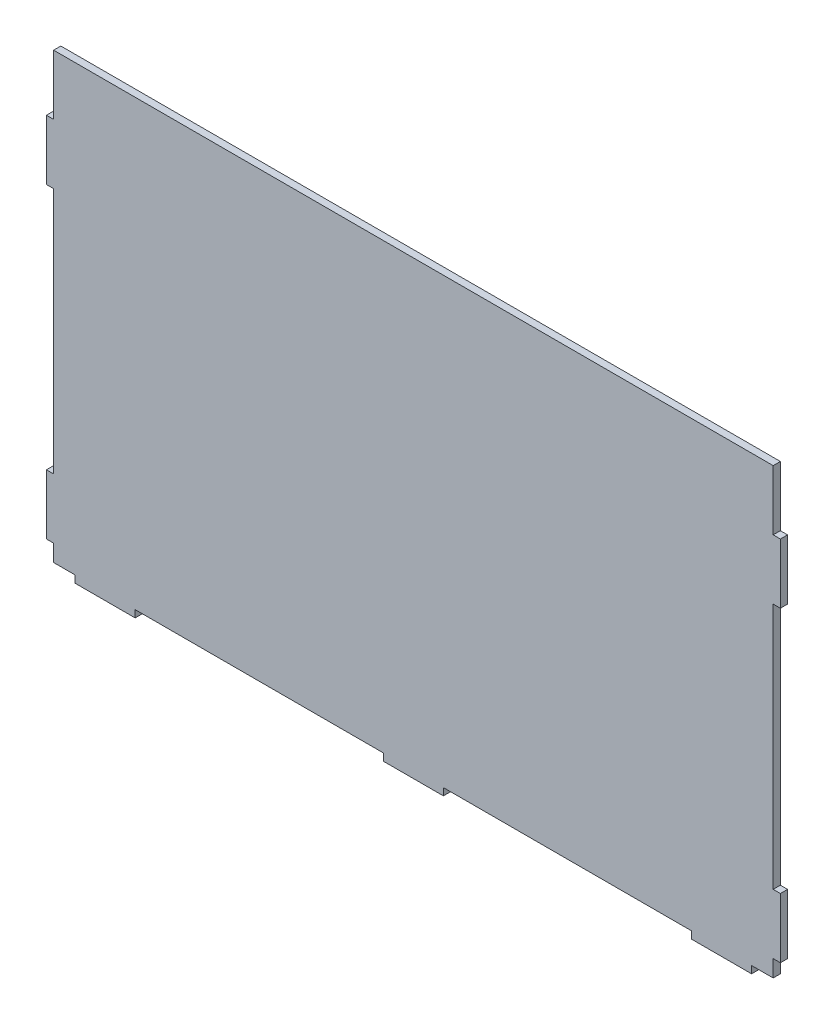
ISO-10303-21;
HEADER;
FILE_DESCRIPTION(('STEP AP214'),'2;1');
FILE_NAME('part.step','',(''),(''),'','','');
FILE_SCHEMA(('AUTOMOTIVE_DESIGN { 1 0 10303 214 1 1 1 1 }'));
ENDSEC;
DATA;
#1=APPLICATION_CONTEXT('core data for automotive mechanical design processes');
#2=APPLICATION_PROTOCOL_DEFINITION('international standard','automotive_design',2000,#1);
#3=PRODUCT_CONTEXT('',#1,'mechanical');
#4=PRODUCT('Part','Part','',(#3));
#5=PRODUCT_RELATED_PRODUCT_CATEGORY('part','',(#4));
#6=PRODUCT_DEFINITION_FORMATION('','',#4);
#7=PRODUCT_DEFINITION_CONTEXT('part definition',#1,'design');
#8=PRODUCT_DEFINITION('design','',#6,#7);
#9=PRODUCT_DEFINITION_SHAPE('','',#8);
#10=(LENGTH_UNIT() NAMED_UNIT(*) SI_UNIT(.MILLI.,.METRE.));
#11=(NAMED_UNIT(*) PLANE_ANGLE_UNIT() SI_UNIT($,.RADIAN.));
#12=(NAMED_UNIT(*) SI_UNIT($,.STERADIAN.) SOLID_ANGLE_UNIT());
#13=UNCERTAINTY_MEASURE_WITH_UNIT(LENGTH_MEASURE(1.E-05),#10,'distance_accuracy_value','');
#14=(GEOMETRIC_REPRESENTATION_CONTEXT(3) GLOBAL_UNCERTAINTY_ASSIGNED_CONTEXT((#13)) GLOBAL_UNIT_ASSIGNED_CONTEXT((#10,
#11,#12)) REPRESENTATION_CONTEXT('',''));
#15=CARTESIAN_POINT('',(0.,0.,0.));
#16=DIRECTION('',(0.,0.,1.));
#17=DIRECTION('',(1.,0.,0.));
#18=AXIS2_PLACEMENT_3D('',#15,#16,#17);
#19=CARTESIAN_POINT('',(-453.035402998338,-651.102908621562,6.));
#20=DIRECTION('',(1.,0.,0.));
#21=DIRECTION('',(0.,0.,-1.));
#22=AXIS2_PLACEMENT_3D('',#19,#20,#21);
#23=PLANE('',#22);
#24=DIRECTION('',(0.,-1.,0.));
#25=VECTOR('',#24,1.);
#26=CARTESIAN_POINT('',(-453.035402998338,-651.102908621562,0.));
#27=LINE('',#26,#25);
#28=CARTESIAN_POINT('',(-453.035402998338,-651.102908621562,0.));
#29=VERTEX_POINT('',#28);
#30=CARTESIAN_POINT('',(-453.035402998338,-701.102908621562,0.));
#31=VERTEX_POINT('',#30);
#32=EDGE_CURVE('E273',#29,#31,#27,.T.);
#33=ORIENTED_EDGE('',*,*,#32,.T.);
#34=DIRECTION('',(0.,0.,-1.));
#35=VECTOR('',#34,1.);
#36=CARTESIAN_POINT('',(-453.035402998338,-701.102908621562,6.));
#37=LINE('',#36,#35);
#38=CARTESIAN_POINT('',(-453.035402998338,-701.102908621562,6.));
#39=VERTEX_POINT('',#38);
#40=EDGE_CURVE('E11',#39,#31,#37,.T.);
#41=ORIENTED_EDGE('',*,*,#40,.F.);
#42=DIRECTION('',(0.,-1.,0.));
#43=VECTOR('',#42,1.);
#44=CARTESIAN_POINT('',(-453.035402998338,-651.102908621562,6.));
#45=LINE('',#44,#43);
#46=CARTESIAN_POINT('',(-453.035402998338,-651.102908621562,6.));
#47=VERTEX_POINT('',#46);
#48=EDGE_CURVE('E335',#47,#39,#45,.T.);
#49=ORIENTED_EDGE('',*,*,#48,.F.);
#50=DIRECTION('',(0.,0.,-1.));
#51=VECTOR('',#50,1.);
#52=CARTESIAN_POINT('',(-453.035402998338,-651.102908621562,6.));
#53=LINE('',#52,#51);
#54=EDGE_CURVE('E269',#47,#29,#53,.T.);
#55=ORIENTED_EDGE('',*,*,#54,.T.);
#56=EDGE_LOOP('',(#33,#41,#49,#55));
#57=FACE_BOUND('',#56,.T.);
#58=ADVANCED_FACE('F33',(#57),#23,.F.);
#59=CARTESIAN_POINT('',(-453.035402998338,-701.102908621562,6.));
#60=DIRECTION('',(0.,-1.,0.));
#61=DIRECTION('',(0.,0.,-1.));
#62=AXIS2_PLACEMENT_3D('',#59,#60,#61);
#63=PLANE('',#62);
#64=DIRECTION('',(-1.,0.,0.));
#65=VECTOR('',#64,1.);
#66=CARTESIAN_POINT('',(-453.035402998338,-701.102908621562,0.));
#67=LINE('',#66,#65);
#68=CARTESIAN_POINT('',(-459.035402998338,-701.102908621562,0.));
#69=VERTEX_POINT('',#68);
#70=EDGE_CURVE('E276',#31,#69,#67,.T.);
#71=ORIENTED_EDGE('',*,*,#70,.T.);
#72=DIRECTION('',(0.,0.,-1.));
#73=VECTOR('',#72,1.);
#74=CARTESIAN_POINT('',(-459.035402998338,-701.102908621562,6.));
#75=LINE('',#74,#73);
#76=CARTESIAN_POINT('',(-459.035402998338,-701.102908621562,6.));
#77=VERTEX_POINT('',#76);
#78=EDGE_CURVE('E41',#77,#69,#75,.T.);
#79=ORIENTED_EDGE('',*,*,#78,.F.);
#80=DIRECTION('',(-1.,0.,0.));
#81=VECTOR('',#80,1.);
#82=CARTESIAN_POINT('',(-453.035402998338,-701.102908621562,6.));
#83=LINE('',#82,#81);
#84=EDGE_CURVE('E164',#39,#77,#83,.T.);
#85=ORIENTED_EDGE('',*,*,#84,.F.);
#86=ORIENTED_EDGE('',*,*,#40,.T.);
#87=EDGE_LOOP('',(#71,#79,#85,#86));
#88=FACE_BOUND('',#87,.T.);
#89=ADVANCED_FACE('F513',(#88),#63,.F.);
#90=CARTESIAN_POINT('',(-459.035402998338,-701.102908621562,6.));
#91=DIRECTION('',(1.,0.,0.));
#92=DIRECTION('',(0.,1.,0.));
#93=AXIS2_PLACEMENT_3D('',#90,#91,#92);
#94=PLANE('',#93);
#95=DIRECTION('',(0.,-1.,0.));
#96=VECTOR('',#95,1.);
#97=CARTESIAN_POINT('',(-459.035402998338,-701.102908621562,0.));
#98=LINE('',#97,#96);
#99=CARTESIAN_POINT('',(-459.035402998338,-751.102908621562,0.));
#100=VERTEX_POINT('',#99);
#101=EDGE_CURVE('E278',#69,#100,#98,.T.);
#102=ORIENTED_EDGE('',*,*,#101,.T.);
#103=DIRECTION('',(0.,0.,-1.));
#104=VECTOR('',#103,1.);
#105=CARTESIAN_POINT('',(-459.035402998338,-751.102908621562,6.));
#106=LINE('',#105,#104);
#107=CARTESIAN_POINT('',(-459.035402998338,-751.102908621562,6.));
#108=VERTEX_POINT('',#107);
#109=EDGE_CURVE('E414',#108,#100,#106,.T.);
#110=ORIENTED_EDGE('',*,*,#109,.F.);
#111=DIRECTION('',(0.,-1.,0.));
#112=VECTOR('',#111,1.);
#113=CARTESIAN_POINT('',(-459.035402998338,-701.102908621562,6.));
#114=LINE('',#113,#112);
#115=EDGE_CURVE('E422',#77,#108,#114,.T.);
#116=ORIENTED_EDGE('',*,*,#115,.F.);
#117=ORIENTED_EDGE('',*,*,#78,.T.);
#118=EDGE_LOOP('',(#102,#110,#116,#117));
#119=FACE_BOUND('',#118,.T.);
#120=ADVANCED_FACE('F420',(#119),#94,.F.);
#121=CARTESIAN_POINT('',(-459.035402998338,-751.102908621562,6.));
#122=DIRECTION('',(0.,1.,0.));
#123=DIRECTION('',(0.,0.,1.));
#124=AXIS2_PLACEMENT_3D('',#121,#122,#123);
#125=PLANE('',#124);
#126=DIRECTION('',(1.,0.,0.));
#127=VECTOR('',#126,1.);
#128=CARTESIAN_POINT('',(-459.035402998338,-751.102908621562,0.));
#129=LINE('',#128,#127);
#130=CARTESIAN_POINT('',(-453.035402998338,-751.102908621562,0.));
#131=VERTEX_POINT('',#130);
#132=EDGE_CURVE('E280',#100,#131,#129,.T.);
#133=ORIENTED_EDGE('',*,*,#132,.T.);
#134=DIRECTION('',(0.,0.,-1.));
#135=VECTOR('',#134,1.);
#136=CARTESIAN_POINT('',(-453.035402998338,-751.102908621562,6.));
#137=LINE('',#136,#135);
#138=CARTESIAN_POINT('',(-453.035402998338,-751.102908621562,6.));
#139=VERTEX_POINT('',#138);
#140=EDGE_CURVE('E411',#139,#131,#137,.T.);
#141=ORIENTED_EDGE('',*,*,#140,.F.);
#142=DIRECTION('',(1.,0.,0.));
#143=VECTOR('',#142,1.);
#144=CARTESIAN_POINT('',(-459.035402998338,-751.102908621562,6.));
#145=LINE('',#144,#143);
#146=EDGE_CURVE('E440',#108,#139,#145,.T.);
#147=ORIENTED_EDGE('',*,*,#146,.F.);
#148=ORIENTED_EDGE('',*,*,#109,.T.);
#149=EDGE_LOOP('',(#133,#141,#147,#148));
#150=FACE_BOUND('',#149,.T.);
#151=ADVANCED_FACE('F431',(#150),#125,.F.);
#152=CARTESIAN_POINT('',(-453.035402998338,-751.102908621562,6.));
#153=DIRECTION('',(1.,0.,0.));
#154=DIRECTION('',(0.,1.,0.));
#155=AXIS2_PLACEMENT_3D('',#152,#153,#154);
#156=PLANE('',#155);
#157=DIRECTION('',(0.,-1.,0.));
#158=VECTOR('',#157,1.);
#159=CARTESIAN_POINT('',(-453.035402998338,-751.102908621562,0.));
#160=LINE('',#159,#158);
#161=CARTESIAN_POINT('',(-453.035402998338,-957.102908621562,0.));
#162=VERTEX_POINT('',#161);
#163=EDGE_CURVE('E282',#131,#162,#160,.T.);
#164=ORIENTED_EDGE('',*,*,#163,.T.);
#165=DIRECTION('',(0.,0.,-1.));
#166=VECTOR('',#165,1.);
#167=CARTESIAN_POINT('',(-453.035402998338,-957.102908621562,6.));
#168=LINE('',#167,#166);
#169=CARTESIAN_POINT('',(-453.035402998338,-957.102908621562,6.));
#170=VERTEX_POINT('',#169);
#171=EDGE_CURVE('E408',#170,#162,#168,.T.);
#172=ORIENTED_EDGE('',*,*,#171,.F.);
#173=DIRECTION('',(0.,-1.,0.));
#174=VECTOR('',#173,1.);
#175=CARTESIAN_POINT('',(-453.035402998338,-751.102908621562,6.));
#176=LINE('',#175,#174);
#177=EDGE_CURVE('E437',#139,#170,#176,.T.);
#178=ORIENTED_EDGE('',*,*,#177,.F.);
#179=ORIENTED_EDGE('',*,*,#140,.T.);
#180=EDGE_LOOP('',(#164,#172,#178,#179));
#181=FACE_BOUND('',#180,.T.);
#182=ADVANCED_FACE('F435',(#181),#156,.F.);
#183=CARTESIAN_POINT('',(-459.035402998338,-957.102908621562,6.));
#184=DIRECTION('',(0.,-1.,0.));
#185=DIRECTION('',(0.,0.,-1.));
#186=AXIS2_PLACEMENT_3D('',#183,#184,#185);
#187=PLANE('',#186);
#188=DIRECTION('',(-1.,0.,0.));
#189=VECTOR('',#188,1.);
#190=CARTESIAN_POINT('',(-459.035402998338,-957.102908621562,0.));
#191=LINE('',#190,#189);
#192=CARTESIAN_POINT('',(-459.035402998338,-957.102908621562,0.));
#193=VERTEX_POINT('',#192);
#194=EDGE_CURVE('E284',#162,#193,#191,.T.);
#195=ORIENTED_EDGE('',*,*,#194,.T.);
#196=DIRECTION('',(0.,0.,-1.));
#197=VECTOR('',#196,1.);
#198=CARTESIAN_POINT('',(-459.035402998338,-957.102908621562,6.));
#199=LINE('',#198,#197);
#200=CARTESIAN_POINT('',(-459.035402998338,-957.102908621562,6.));
#201=VERTEX_POINT('',#200);
#202=EDGE_CURVE('E405',#201,#193,#199,.T.);
#203=ORIENTED_EDGE('',*,*,#202,.F.);
#204=DIRECTION('',(-1.,0.,0.));
#205=VECTOR('',#204,1.);
#206=CARTESIAN_POINT('',(-459.035402998338,-957.102908621562,6.));
#207=LINE('',#206,#205);
#208=EDGE_CURVE('E439',#170,#201,#207,.T.);
#209=ORIENTED_EDGE('',*,*,#208,.F.);
#210=ORIENTED_EDGE('',*,*,#171,.T.);
#211=EDGE_LOOP('',(#195,#203,#209,#210));
#212=FACE_BOUND('',#211,.T.);
#213=ADVANCED_FACE('F526',(#212),#187,.F.);
#214=CARTESIAN_POINT('',(-459.035402998338,-1007.10290862156,6.));
#215=DIRECTION('',(1.,0.,0.));
#216=DIRECTION('',(0.,1.,0.));
#217=AXIS2_PLACEMENT_3D('',#214,#215,#216);
#218=PLANE('',#217);
#219=DIRECTION('',(0.,-1.,0.));
#220=VECTOR('',#219,1.);
#221=CARTESIAN_POINT('',(-459.035402998338,-1007.10290862156,0.));
#222=LINE('',#221,#220);
#223=CARTESIAN_POINT('',(-459.035402998338,-1007.10290862156,0.));
#224=VERTEX_POINT('',#223);
#225=EDGE_CURVE('E286',#193,#224,#222,.T.);
#226=ORIENTED_EDGE('',*,*,#225,.T.);
#227=DIRECTION('',(0.,0.,-1.));
#228=VECTOR('',#227,1.);
#229=CARTESIAN_POINT('',(-459.035402998338,-1007.10290862156,6.));
#230=LINE('',#229,#228);
#231=CARTESIAN_POINT('',(-459.035402998338,-1007.10290862156,6.));
#232=VERTEX_POINT('',#231);
#233=EDGE_CURVE('E402',#232,#224,#230,.T.);
#234=ORIENTED_EDGE('',*,*,#233,.F.);
#235=DIRECTION('',(0.,-1.,0.));
#236=VECTOR('',#235,1.);
#237=CARTESIAN_POINT('',(-459.035402998338,-1007.10290862156,6.));
#238=LINE('',#237,#236);
#239=EDGE_CURVE('E442',#201,#232,#238,.T.);
#240=ORIENTED_EDGE('',*,*,#239,.F.);
#241=ORIENTED_EDGE('',*,*,#202,.T.);
#242=EDGE_LOOP('',(#226,#234,#240,#241));
#243=FACE_BOUND('',#242,.T.);
#244=ADVANCED_FACE('F529',(#243),#218,.F.);
#245=CARTESIAN_POINT('',(-453.035402998337,-1007.10290862156,6.));
#246=DIRECTION('',(0.,1.,0.));
#247=DIRECTION('',(0.,0.,1.));
#248=AXIS2_PLACEMENT_3D('',#245,#246,#247);
#249=PLANE('',#248);
#250=DIRECTION('',(1.,0.,0.));
#251=VECTOR('',#250,1.);
#252=CARTESIAN_POINT('',(-453.035402998337,-1007.10290862156,0.));
#253=LINE('',#252,#251);
#254=CARTESIAN_POINT('',(-453.035402998337,-1007.10290862156,0.));
#255=VERTEX_POINT('',#254);
#256=EDGE_CURVE('E288',#224,#255,#253,.T.);
#257=ORIENTED_EDGE('',*,*,#256,.T.);
#258=DIRECTION('',(0.,0.,-1.));
#259=VECTOR('',#258,1.);
#260=CARTESIAN_POINT('',(-453.035402998337,-1007.10290862156,6.));
#261=LINE('',#260,#259);
#262=CARTESIAN_POINT('',(-453.035402998337,-1007.10290862156,6.));
#263=VERTEX_POINT('',#262);
#264=EDGE_CURVE('E399',#263,#255,#261,.T.);
#265=ORIENTED_EDGE('',*,*,#264,.F.);
#266=DIRECTION('',(1.,0.,0.));
#267=VECTOR('',#266,1.);
#268=CARTESIAN_POINT('',(-453.035402998337,-1007.10290862156,6.));
#269=LINE('',#268,#267);
#270=EDGE_CURVE('E448',#232,#263,#269,.T.);
#271=ORIENTED_EDGE('',*,*,#270,.F.);
#272=ORIENTED_EDGE('',*,*,#233,.T.);
#273=EDGE_LOOP('',(#257,#265,#271,#272));
#274=FACE_BOUND('',#273,.T.);
#275=ADVANCED_FACE('F533',(#274),#249,.F.);
#276=CARTESIAN_POINT('',(-453.035402998337,-1021.10290862156,6.));
#277=DIRECTION('',(1.,0.,0.));
#278=DIRECTION('',(0.,1.,0.));
#279=AXIS2_PLACEMENT_3D('',#276,#277,#278);
#280=PLANE('',#279);
#281=DIRECTION('',(0.,-1.,0.));
#282=VECTOR('',#281,1.);
#283=CARTESIAN_POINT('',(-453.035402998337,-1021.10290862156,0.));
#284=LINE('',#283,#282);
#285=CARTESIAN_POINT('',(-453.035402998337,-1021.10290862156,0.));
#286=VERTEX_POINT('',#285);
#287=EDGE_CURVE('E290',#255,#286,#284,.T.);
#288=ORIENTED_EDGE('',*,*,#287,.T.);
#289=DIRECTION('',(0.,0.,-1.));
#290=VECTOR('',#289,1.);
#291=CARTESIAN_POINT('',(-453.035402998337,-1021.10290862156,6.));
#292=LINE('',#291,#290);
#293=CARTESIAN_POINT('',(-453.035402998337,-1021.10290862156,6.));
#294=VERTEX_POINT('',#293);
#295=EDGE_CURVE('E396',#294,#286,#292,.T.);
#296=ORIENTED_EDGE('',*,*,#295,.F.);
#297=DIRECTION('',(0.,-1.,0.));
#298=VECTOR('',#297,1.);
#299=CARTESIAN_POINT('',(-453.035402998337,-1021.10290862156,6.));
#300=LINE('',#299,#298);
#301=EDGE_CURVE('E450',#263,#294,#300,.T.);
#302=ORIENTED_EDGE('',*,*,#301,.F.);
#303=ORIENTED_EDGE('',*,*,#264,.T.);
#304=EDGE_LOOP('',(#288,#296,#302,#303));
#305=FACE_BOUND('',#304,.T.);
#306=ADVANCED_FACE('F537',(#305),#280,.F.);
#307=CARTESIAN_POINT('',(-435.035402998337,-1021.10290862156,6.));
#308=DIRECTION('',(0.,1.,0.));
#309=DIRECTION('',(0.,0.,1.));
#310=AXIS2_PLACEMENT_3D('',#307,#308,#309);
#311=PLANE('',#310);
#312=DIRECTION('',(1.,0.,0.));
#313=VECTOR('',#312,1.);
#314=CARTESIAN_POINT('',(-435.035402998337,-1021.10290862156,0.));
#315=LINE('',#314,#313);
#316=CARTESIAN_POINT('',(-435.035402998337,-1021.10290862156,0.));
#317=VERTEX_POINT('',#316);
#318=EDGE_CURVE('E292',#286,#317,#315,.T.);
#319=ORIENTED_EDGE('',*,*,#318,.T.);
#320=DIRECTION('',(0.,0.,-1.));
#321=VECTOR('',#320,1.);
#322=CARTESIAN_POINT('',(-435.035402998337,-1021.10290862156,6.));
#323=LINE('',#322,#321);
#324=CARTESIAN_POINT('',(-435.035402998337,-1021.10290862156,6.));
#325=VERTEX_POINT('',#324);
#326=EDGE_CURVE('E393',#325,#317,#323,.T.);
#327=ORIENTED_EDGE('',*,*,#326,.F.);
#328=DIRECTION('',(1.,0.,0.));
#329=VECTOR('',#328,1.);
#330=CARTESIAN_POINT('',(-435.035402998337,-1021.10290862156,6.));
#331=LINE('',#330,#329);
#332=EDGE_CURVE('E452',#294,#325,#331,.T.);
#333=ORIENTED_EDGE('',*,*,#332,.F.);
#334=ORIENTED_EDGE('',*,*,#295,.T.);
#335=EDGE_LOOP('',(#319,#327,#333,#334));
#336=FACE_BOUND('',#335,.T.);
#337=ADVANCED_FACE('F541',(#336),#311,.F.);
#338=CARTESIAN_POINT('',(-435.035402998337,-1021.10290862156,6.));
#339=DIRECTION('',(1.,0.,0.));
#340=DIRECTION('',(0.,0.,-1.));
#341=AXIS2_PLACEMENT_3D('',#338,#339,#340);
#342=PLANE('',#341);
#343=DIRECTION('',(0.,-1.,0.));
#344=VECTOR('',#343,1.);
#345=CARTESIAN_POINT('',(-435.035402998337,-1021.10290862156,0.));
#346=LINE('',#345,#344);
#347=CARTESIAN_POINT('',(-435.035402998337,-1027.10290862156,0.));
#348=VERTEX_POINT('',#347);
#349=EDGE_CURVE('E294',#317,#348,#346,.T.);
#350=ORIENTED_EDGE('',*,*,#349,.T.);
#351=DIRECTION('',(0.,0.,-1.));
#352=VECTOR('',#351,1.);
#353=CARTESIAN_POINT('',(-435.035402998337,-1027.10290862156,6.));
#354=LINE('',#353,#352);
#355=CARTESIAN_POINT('',(-435.035402998337,-1027.10290862156,6.));
#356=VERTEX_POINT('',#355);
#357=EDGE_CURVE('E390',#356,#348,#354,.T.);
#358=ORIENTED_EDGE('',*,*,#357,.F.);
#359=DIRECTION('',(0.,-1.,0.));
#360=VECTOR('',#359,1.);
#361=CARTESIAN_POINT('',(-435.035402998337,-1021.10290862156,6.));
#362=LINE('',#361,#360);
#363=EDGE_CURVE('E454',#325,#356,#362,.T.);
#364=ORIENTED_EDGE('',*,*,#363,.F.);
#365=ORIENTED_EDGE('',*,*,#326,.T.);
#366=EDGE_LOOP('',(#350,#358,#364,#365));
#367=FACE_BOUND('',#366,.T.);
#368=ADVANCED_FACE('F545',(#367),#342,.F.);
#369=CARTESIAN_POINT('',(-435.035402998337,-1027.10290862156,6.));
#370=DIRECTION('',(0.,1.,0.));
#371=DIRECTION('',(0.,0.,1.));
#372=AXIS2_PLACEMENT_3D('',#369,#370,#371);
#373=PLANE('',#372);
#374=DIRECTION('',(1.,0.,0.));
#375=VECTOR('',#374,1.);
#376=CARTESIAN_POINT('',(-435.035402998337,-1027.10290862156,0.));
#377=LINE('',#376,#375);
#378=CARTESIAN_POINT('',(-385.035402998337,-1027.10290862156,0.));
#379=VERTEX_POINT('',#378);
#380=EDGE_CURVE('E296',#348,#379,#377,.T.);
#381=ORIENTED_EDGE('',*,*,#380,.T.);
#382=DIRECTION('',(0.,0.,-1.));
#383=VECTOR('',#382,1.);
#384=CARTESIAN_POINT('',(-385.035402998337,-1027.10290862156,6.));
#385=LINE('',#384,#383);
#386=CARTESIAN_POINT('',(-385.035402998337,-1027.10290862156,6.));
#387=VERTEX_POINT('',#386);
#388=EDGE_CURVE('E387',#387,#379,#385,.T.);
#389=ORIENTED_EDGE('',*,*,#388,.F.);
#390=DIRECTION('',(1.,0.,0.));
#391=VECTOR('',#390,1.);
#392=CARTESIAN_POINT('',(-435.035402998337,-1027.10290862156,6.));
#393=LINE('',#392,#391);
#394=EDGE_CURVE('E456',#356,#387,#393,.T.);
#395=ORIENTED_EDGE('',*,*,#394,.F.);
#396=ORIENTED_EDGE('',*,*,#357,.T.);
#397=EDGE_LOOP('',(#381,#389,#395,#396));
#398=FACE_BOUND('',#397,.T.);
#399=ADVANCED_FACE('F549',(#398),#373,.F.);
#400=CARTESIAN_POINT('',(-385.035402998337,-1021.10290862156,6.));
#401=DIRECTION('',(-1.,0.,0.));
#402=DIRECTION('',(0.,-1.,0.));
#403=AXIS2_PLACEMENT_3D('',#400,#401,#402);
#404=PLANE('',#403);
#405=DIRECTION('',(0.,1.,0.));
#406=VECTOR('',#405,1.);
#407=CARTESIAN_POINT('',(-385.035402998337,-1021.10290862156,0.));
#408=LINE('',#407,#406);
#409=CARTESIAN_POINT('',(-385.035402998337,-1021.10290862156,0.));
#410=VERTEX_POINT('',#409);
#411=EDGE_CURVE('E298',#379,#410,#408,.T.);
#412=ORIENTED_EDGE('',*,*,#411,.T.);
#413=DIRECTION('',(0.,0.,-1.));
#414=VECTOR('',#413,1.);
#415=CARTESIAN_POINT('',(-385.035402998337,-1021.10290862156,6.));
#416=LINE('',#415,#414);
#417=CARTESIAN_POINT('',(-385.035402998337,-1021.10290862156,6.));
#418=VERTEX_POINT('',#417);
#419=EDGE_CURVE('E384',#418,#410,#416,.T.);
#420=ORIENTED_EDGE('',*,*,#419,.F.);
#421=DIRECTION('',(0.,1.,0.));
#422=VECTOR('',#421,1.);
#423=CARTESIAN_POINT('',(-385.035402998337,-1021.10290862156,6.));
#424=LINE('',#423,#422);
#425=EDGE_CURVE('E458',#387,#418,#424,.T.);
#426=ORIENTED_EDGE('',*,*,#425,.F.);
#427=ORIENTED_EDGE('',*,*,#388,.T.);
#428=EDGE_LOOP('',(#412,#420,#426,#427));
#429=FACE_BOUND('',#428,.T.);
#430=ADVANCED_FACE('F553',(#429),#404,.F.);
#431=CARTESIAN_POINT('',(-178.035402998337,-1021.10290862156,6.));
#432=DIRECTION('',(0.,1.,0.));
#433=DIRECTION('',(0.,0.,1.));
#434=AXIS2_PLACEMENT_3D('',#431,#432,#433);
#435=PLANE('',#434);
#436=DIRECTION('',(1.,0.,0.));
#437=VECTOR('',#436,1.);
#438=CARTESIAN_POINT('',(-178.035402998337,-1021.10290862156,0.));
#439=LINE('',#438,#437);
#440=CARTESIAN_POINT('',(-178.035402998337,-1021.10290862156,0.));
#441=VERTEX_POINT('',#440);
#442=EDGE_CURVE('E300',#410,#441,#439,.T.);
#443=ORIENTED_EDGE('',*,*,#442,.T.);
#444=DIRECTION('',(0.,0.,-1.));
#445=VECTOR('',#444,1.);
#446=CARTESIAN_POINT('',(-178.035402998337,-1021.10290862156,6.));
#447=LINE('',#446,#445);
#448=CARTESIAN_POINT('',(-178.035402998337,-1021.10290862156,6.));
#449=VERTEX_POINT('',#448);
#450=EDGE_CURVE('E381',#449,#441,#447,.T.);
#451=ORIENTED_EDGE('',*,*,#450,.F.);
#452=DIRECTION('',(1.,0.,0.));
#453=VECTOR('',#452,1.);
#454=CARTESIAN_POINT('',(-178.035402998337,-1021.10290862156,6.));
#455=LINE('',#454,#453);
#456=EDGE_CURVE('E460',#418,#449,#455,.T.);
#457=ORIENTED_EDGE('',*,*,#456,.F.);
#458=ORIENTED_EDGE('',*,*,#419,.T.);
#459=EDGE_LOOP('',(#443,#451,#457,#458));
#460=FACE_BOUND('',#459,.T.);
#461=ADVANCED_FACE('F557',(#460),#435,.F.);
#462=CARTESIAN_POINT('',(-178.035402998337,-1021.10290862156,6.));
#463=DIRECTION('',(1.,0.,0.));
#464=DIRECTION('',(0.,0.,-1.));
#465=AXIS2_PLACEMENT_3D('',#462,#463,#464);
#466=PLANE('',#465);
#467=DIRECTION('',(0.,-1.,0.));
#468=VECTOR('',#467,1.);
#469=CARTESIAN_POINT('',(-178.035402998337,-1021.10290862156,0.));
#470=LINE('',#469,#468);
#471=CARTESIAN_POINT('',(-178.035402998337,-1027.10290862156,0.));
#472=VERTEX_POINT('',#471);
#473=EDGE_CURVE('E302',#441,#472,#470,.T.);
#474=ORIENTED_EDGE('',*,*,#473,.T.);
#475=DIRECTION('',(0.,0.,-1.));
#476=VECTOR('',#475,1.);
#477=CARTESIAN_POINT('',(-178.035402998337,-1027.10290862156,6.));
#478=LINE('',#477,#476);
#479=CARTESIAN_POINT('',(-178.035402998337,-1027.10290862156,6.));
#480=VERTEX_POINT('',#479);
#481=EDGE_CURVE('E378',#480,#472,#478,.T.);
#482=ORIENTED_EDGE('',*,*,#481,.F.);
#483=DIRECTION('',(0.,-1.,0.));
#484=VECTOR('',#483,1.);
#485=CARTESIAN_POINT('',(-178.035402998337,-1021.10290862156,6.));
#486=LINE('',#485,#484);
#487=EDGE_CURVE('E462',#449,#480,#486,.T.);
#488=ORIENTED_EDGE('',*,*,#487,.F.);
#489=ORIENTED_EDGE('',*,*,#450,.T.);
#490=EDGE_LOOP('',(#474,#482,#488,#489));
#491=FACE_BOUND('',#490,.T.);
#492=ADVANCED_FACE('F561',(#491),#466,.F.);
#493=CARTESIAN_POINT('',(-178.035402998337,-1027.10290862156,6.));
#494=DIRECTION('',(0.,1.,0.));
#495=DIRECTION('',(0.,0.,1.));
#496=AXIS2_PLACEMENT_3D('',#493,#494,#495);
#497=PLANE('',#496);
#498=DIRECTION('',(1.,0.,0.));
#499=VECTOR('',#498,1.);
#500=CARTESIAN_POINT('',(-178.035402998337,-1027.10290862156,0.));
#501=LINE('',#500,#499);
#502=CARTESIAN_POINT('',(-128.035402998337,-1027.10290862156,0.));
#503=VERTEX_POINT('',#502);
#504=EDGE_CURVE('E304',#472,#503,#501,.T.);
#505=ORIENTED_EDGE('',*,*,#504,.T.);
#506=DIRECTION('',(0.,0.,-1.));
#507=VECTOR('',#506,1.);
#508=CARTESIAN_POINT('',(-128.035402998337,-1027.10290862156,6.));
#509=LINE('',#508,#507);
#510=CARTESIAN_POINT('',(-128.035402998337,-1027.10290862156,6.));
#511=VERTEX_POINT('',#510);
#512=EDGE_CURVE('E375',#511,#503,#509,.T.);
#513=ORIENTED_EDGE('',*,*,#512,.F.);
#514=DIRECTION('',(1.,0.,0.));
#515=VECTOR('',#514,1.);
#516=CARTESIAN_POINT('',(-178.035402998337,-1027.10290862156,6.));
#517=LINE('',#516,#515);
#518=EDGE_CURVE('E464',#480,#511,#517,.T.);
#519=ORIENTED_EDGE('',*,*,#518,.F.);
#520=ORIENTED_EDGE('',*,*,#481,.T.);
#521=EDGE_LOOP('',(#505,#513,#519,#520));
#522=FACE_BOUND('',#521,.T.);
#523=ADVANCED_FACE('F565',(#522),#497,.F.);
#524=CARTESIAN_POINT('',(-128.035402998337,-1021.10290862156,6.));
#525=DIRECTION('',(-1.,0.,0.));
#526=DIRECTION('',(0.,0.,1.));
#527=AXIS2_PLACEMENT_3D('',#524,#525,#526);
#528=PLANE('',#527);
#529=DIRECTION('',(0.,1.,0.));
#530=VECTOR('',#529,1.);
#531=CARTESIAN_POINT('',(-128.035402998337,-1021.10290862156,0.));
#532=LINE('',#531,#530);
#533=CARTESIAN_POINT('',(-128.035402998337,-1021.10290862156,0.));
#534=VERTEX_POINT('',#533);
#535=EDGE_CURVE('E306',#503,#534,#532,.T.);
#536=ORIENTED_EDGE('',*,*,#535,.T.);
#537=DIRECTION('',(0.,0.,-1.));
#538=VECTOR('',#537,1.);
#539=CARTESIAN_POINT('',(-128.035402998337,-1021.10290862156,6.));
#540=LINE('',#539,#538);
#541=CARTESIAN_POINT('',(-128.035402998337,-1021.10290862156,6.));
#542=VERTEX_POINT('',#541);
#543=EDGE_CURVE('E372',#542,#534,#540,.T.);
#544=ORIENTED_EDGE('',*,*,#543,.F.);
#545=DIRECTION('',(0.,1.,0.));
#546=VECTOR('',#545,1.);
#547=CARTESIAN_POINT('',(-128.035402998337,-1021.10290862156,6.));
#548=LINE('',#547,#546);
#549=EDGE_CURVE('E466',#511,#542,#548,.T.);
#550=ORIENTED_EDGE('',*,*,#549,.F.);
#551=ORIENTED_EDGE('',*,*,#512,.T.);
#552=EDGE_LOOP('',(#536,#544,#550,#551));
#553=FACE_BOUND('',#552,.T.);
#554=ADVANCED_FACE('F569',(#553),#528,.F.);
#555=CARTESIAN_POINT('',(78.9645970016627,-1021.10290862156,6.));
#556=DIRECTION('',(0.,1.,0.));
#557=DIRECTION('',(0.,0.,1.));
#558=AXIS2_PLACEMENT_3D('',#555,#556,#557);
#559=PLANE('',#558);
#560=DIRECTION('',(1.,0.,0.));
#561=VECTOR('',#560,1.);
#562=CARTESIAN_POINT('',(78.9645970016627,-1021.10290862156,0.));
#563=LINE('',#562,#561);
#564=CARTESIAN_POINT('',(78.9645970016627,-1021.10290862156,0.));
#565=VERTEX_POINT('',#564);
#566=EDGE_CURVE('E308',#534,#565,#563,.T.);
#567=ORIENTED_EDGE('',*,*,#566,.T.);
#568=DIRECTION('',(0.,0.,-1.));
#569=VECTOR('',#568,1.);
#570=CARTESIAN_POINT('',(78.9645970016627,-1021.10290862156,6.));
#571=LINE('',#570,#569);
#572=CARTESIAN_POINT('',(78.9645970016627,-1021.10290862156,6.));
#573=VERTEX_POINT('',#572);
#574=EDGE_CURVE('E369',#573,#565,#571,.T.);
#575=ORIENTED_EDGE('',*,*,#574,.F.);
#576=DIRECTION('',(1.,0.,0.));
#577=VECTOR('',#576,1.);
#578=CARTESIAN_POINT('',(78.9645970016627,-1021.10290862156,6.));
#579=LINE('',#578,#577);
#580=EDGE_CURVE('E468',#542,#573,#579,.T.);
#581=ORIENTED_EDGE('',*,*,#580,.F.);
#582=ORIENTED_EDGE('',*,*,#543,.T.);
#583=EDGE_LOOP('',(#567,#575,#581,#582));
#584=FACE_BOUND('',#583,.T.);
#585=ADVANCED_FACE('F573',(#584),#559,.F.);
#586=CARTESIAN_POINT('',(78.9645970016627,-1021.10290862156,6.));
#587=DIRECTION('',(1.,0.,0.));
#588=DIRECTION('',(0.,0.,-1.));
#589=AXIS2_PLACEMENT_3D('',#586,#587,#588);
#590=PLANE('',#589);
#591=DIRECTION('',(0.,-1.,0.));
#592=VECTOR('',#591,1.);
#593=CARTESIAN_POINT('',(78.9645970016627,-1021.10290862156,0.));
#594=LINE('',#593,#592);
#595=CARTESIAN_POINT('',(78.9645970016627,-1027.10290862156,0.));
#596=VERTEX_POINT('',#595);
#597=EDGE_CURVE('E310',#565,#596,#594,.T.);
#598=ORIENTED_EDGE('',*,*,#597,.T.);
#599=DIRECTION('',(0.,0.,-1.));
#600=VECTOR('',#599,1.);
#601=CARTESIAN_POINT('',(78.9645970016627,-1027.10290862156,6.));
#602=LINE('',#601,#600);
#603=CARTESIAN_POINT('',(78.9645970016627,-1027.10290862156,6.));
#604=VERTEX_POINT('',#603);
#605=EDGE_CURVE('E366',#604,#596,#602,.T.);
#606=ORIENTED_EDGE('',*,*,#605,.F.);
#607=DIRECTION('',(0.,-1.,0.));
#608=VECTOR('',#607,1.);
#609=CARTESIAN_POINT('',(78.9645970016627,-1021.10290862156,6.));
#610=LINE('',#609,#608);
#611=EDGE_CURVE('E470',#573,#604,#610,.T.);
#612=ORIENTED_EDGE('',*,*,#611,.F.);
#613=ORIENTED_EDGE('',*,*,#574,.T.);
#614=EDGE_LOOP('',(#598,#606,#612,#613));
#615=FACE_BOUND('',#614,.T.);
#616=ADVANCED_FACE('F577',(#615),#590,.F.);
#617=CARTESIAN_POINT('',(128.964597001663,-1027.10290862156,6.));
#618=DIRECTION('',(0.,1.,0.));
#619=DIRECTION('',(0.,0.,1.));
#620=AXIS2_PLACEMENT_3D('',#617,#618,#619);
#621=PLANE('',#620);
#622=DIRECTION('',(1.,0.,0.));
#623=VECTOR('',#622,1.);
#624=CARTESIAN_POINT('',(128.964597001663,-1027.10290862156,0.));
#625=LINE('',#624,#623);
#626=CARTESIAN_POINT('',(128.964597001663,-1027.10290862156,0.));
#627=VERTEX_POINT('',#626);
#628=EDGE_CURVE('E312',#596,#627,#625,.T.);
#629=ORIENTED_EDGE('',*,*,#628,.T.);
#630=DIRECTION('',(0.,0.,-1.));
#631=VECTOR('',#630,1.);
#632=CARTESIAN_POINT('',(128.964597001663,-1027.10290862156,6.));
#633=LINE('',#632,#631);
#634=CARTESIAN_POINT('',(128.964597001663,-1027.10290862156,6.));
#635=VERTEX_POINT('',#634);
#636=EDGE_CURVE('E363',#635,#627,#633,.T.);
#637=ORIENTED_EDGE('',*,*,#636,.F.);
#638=DIRECTION('',(1.,0.,0.));
#639=VECTOR('',#638,1.);
#640=CARTESIAN_POINT('',(128.964597001663,-1027.10290862156,6.));
#641=LINE('',#640,#639);
#642=EDGE_CURVE('E472',#604,#635,#641,.T.);
#643=ORIENTED_EDGE('',*,*,#642,.F.);
#644=ORIENTED_EDGE('',*,*,#605,.T.);
#645=EDGE_LOOP('',(#629,#637,#643,#644));
#646=FACE_BOUND('',#645,.T.);
#647=ADVANCED_FACE('F581',(#646),#621,.F.);
#648=CARTESIAN_POINT('',(128.964597001663,-1027.10290862156,6.));
#649=DIRECTION('',(-1.,0.,0.));
#650=DIRECTION('',(0.,0.,1.));
#651=AXIS2_PLACEMENT_3D('',#648,#649,#650);
#652=PLANE('',#651);
#653=DIRECTION('',(0.,1.,0.));
#654=VECTOR('',#653,1.);
#655=CARTESIAN_POINT('',(128.964597001663,-1027.10290862156,0.));
#656=LINE('',#655,#654);
#657=CARTESIAN_POINT('',(128.964597001663,-1021.10290862156,0.));
#658=VERTEX_POINT('',#657);
#659=EDGE_CURVE('E314',#627,#658,#656,.T.);
#660=ORIENTED_EDGE('',*,*,#659,.T.);
#661=DIRECTION('',(0.,0.,-1.));
#662=VECTOR('',#661,1.);
#663=CARTESIAN_POINT('',(128.964597001663,-1021.10290862156,6.));
#664=LINE('',#663,#662);
#665=CARTESIAN_POINT('',(128.964597001663,-1021.10290862156,6.));
#666=VERTEX_POINT('',#665);
#667=EDGE_CURVE('E360',#666,#658,#664,.T.);
#668=ORIENTED_EDGE('',*,*,#667,.F.);
#669=DIRECTION('',(0.,1.,0.));
#670=VECTOR('',#669,1.);
#671=CARTESIAN_POINT('',(128.964597001663,-1027.10290862156,6.));
#672=LINE('',#671,#670);
#673=EDGE_CURVE('E474',#635,#666,#672,.T.);
#674=ORIENTED_EDGE('',*,*,#673,.F.);
#675=ORIENTED_EDGE('',*,*,#636,.T.);
#676=EDGE_LOOP('',(#660,#668,#674,#675));
#677=FACE_BOUND('',#676,.T.);
#678=ADVANCED_FACE('F585',(#677),#652,.F.);
#679=CARTESIAN_POINT('',(128.964597001663,-1021.10290862156,6.));
#680=DIRECTION('',(0.,1.,0.));
#681=DIRECTION('',(-1.,0.,0.));
#682=AXIS2_PLACEMENT_3D('',#679,#680,#681);
#683=PLANE('',#682);
#684=DIRECTION('',(1.,0.,0.));
#685=VECTOR('',#684,1.);
#686=CARTESIAN_POINT('',(128.964597001663,-1021.10290862156,0.));
#687=LINE('',#686,#685);
#688=CARTESIAN_POINT('',(146.964597001662,-1021.10290862156,0.));
#689=VERTEX_POINT('',#688);
#690=EDGE_CURVE('E316',#658,#689,#687,.T.);
#691=ORIENTED_EDGE('',*,*,#690,.T.);
#692=DIRECTION('',(0.,0.,-1.));
#693=VECTOR('',#692,1.);
#694=CARTESIAN_POINT('',(146.964597001662,-1021.10290862156,6.));
#695=LINE('',#694,#693);
#696=CARTESIAN_POINT('',(146.964597001662,-1021.10290862156,6.));
#697=VERTEX_POINT('',#696);
#698=EDGE_CURVE('E357',#697,#689,#695,.T.);
#699=ORIENTED_EDGE('',*,*,#698,.F.);
#700=DIRECTION('',(1.,0.,0.));
#701=VECTOR('',#700,1.);
#702=CARTESIAN_POINT('',(128.964597001663,-1021.10290862156,6.));
#703=LINE('',#702,#701);
#704=EDGE_CURVE('E476',#666,#697,#703,.T.);
#705=ORIENTED_EDGE('',*,*,#704,.F.);
#706=ORIENTED_EDGE('',*,*,#667,.T.);
#707=EDGE_LOOP('',(#691,#699,#705,#706));
#708=FACE_BOUND('',#707,.T.);
#709=ADVANCED_FACE('F589',(#708),#683,.F.);
#710=CARTESIAN_POINT('',(146.964597001662,-1021.10290862156,6.));
#711=DIRECTION('',(-1.,0.,0.));
#712=DIRECTION('',(0.,0.,1.));
#713=AXIS2_PLACEMENT_3D('',#710,#711,#712);
#714=PLANE('',#713);
#715=DIRECTION('',(0.,1.,0.));
#716=VECTOR('',#715,1.);
#717=CARTESIAN_POINT('',(146.964597001662,-1021.10290862156,0.));
#718=LINE('',#717,#716);
#719=CARTESIAN_POINT('',(146.964597001662,-1007.10290862156,0.));
#720=VERTEX_POINT('',#719);
#721=EDGE_CURVE('E318',#689,#720,#718,.T.);
#722=ORIENTED_EDGE('',*,*,#721,.T.);
#723=DIRECTION('',(0.,0.,-1.));
#724=VECTOR('',#723,1.);
#725=CARTESIAN_POINT('',(146.964597001662,-1007.10290862156,6.));
#726=LINE('',#725,#724);
#727=CARTESIAN_POINT('',(146.964597001662,-1007.10290862156,6.));
#728=VERTEX_POINT('',#727);
#729=EDGE_CURVE('E354',#728,#720,#726,.T.);
#730=ORIENTED_EDGE('',*,*,#729,.F.);
#731=DIRECTION('',(0.,1.,0.));
#732=VECTOR('',#731,1.);
#733=CARTESIAN_POINT('',(146.964597001662,-1021.10290862156,6.));
#734=LINE('',#733,#732);
#735=EDGE_CURVE('E478',#697,#728,#734,.T.);
#736=ORIENTED_EDGE('',*,*,#735,.F.);
#737=ORIENTED_EDGE('',*,*,#698,.T.);
#738=EDGE_LOOP('',(#722,#730,#736,#737));
#739=FACE_BOUND('',#738,.T.);
#740=ADVANCED_FACE('F593',(#739),#714,.F.);
#741=CARTESIAN_POINT('',(146.964597001662,-1007.10290862156,6.));
#742=DIRECTION('',(0.,1.,0.));
#743=DIRECTION('',(0.,0.,1.));
#744=AXIS2_PLACEMENT_3D('',#741,#742,#743);
#745=PLANE('',#744);
#746=DIRECTION('',(1.,0.,0.));
#747=VECTOR('',#746,1.);
#748=CARTESIAN_POINT('',(146.964597001662,-1007.10290862156,0.));
#749=LINE('',#748,#747);
#750=CARTESIAN_POINT('',(152.964597001662,-1007.10290862156,0.));
#751=VERTEX_POINT('',#750);
#752=EDGE_CURVE('E320',#720,#751,#749,.T.);
#753=ORIENTED_EDGE('',*,*,#752,.T.);
#754=DIRECTION('',(0.,0.,-1.));
#755=VECTOR('',#754,1.);
#756=CARTESIAN_POINT('',(152.964597001662,-1007.10290862156,6.));
#757=LINE('',#756,#755);
#758=CARTESIAN_POINT('',(152.964597001662,-1007.10290862156,6.));
#759=VERTEX_POINT('',#758);
#760=EDGE_CURVE('E351',#759,#751,#757,.T.);
#761=ORIENTED_EDGE('',*,*,#760,.F.);
#762=DIRECTION('',(1.,0.,0.));
#763=VECTOR('',#762,1.);
#764=CARTESIAN_POINT('',(146.964597001662,-1007.10290862156,6.));
#765=LINE('',#764,#763);
#766=EDGE_CURVE('E480',#728,#759,#765,.T.);
#767=ORIENTED_EDGE('',*,*,#766,.F.);
#768=ORIENTED_EDGE('',*,*,#729,.T.);
#769=EDGE_LOOP('',(#753,#761,#767,#768));
#770=FACE_BOUND('',#769,.T.);
#771=ADVANCED_FACE('F597',(#770),#745,.F.);
#772=CARTESIAN_POINT('',(152.964597001662,-1007.10290862156,6.));
#773=DIRECTION('',(-1.,0.,0.));
#774=DIRECTION('',(0.,-1.,0.));
#775=AXIS2_PLACEMENT_3D('',#772,#773,#774);
#776=PLANE('',#775);
#777=DIRECTION('',(0.,1.,0.));
#778=VECTOR('',#777,1.);
#779=CARTESIAN_POINT('',(152.964597001662,-1007.10290862156,0.));
#780=LINE('',#779,#778);
#781=CARTESIAN_POINT('',(152.964597001663,-957.102908621562,0.));
#782=VERTEX_POINT('',#781);
#783=EDGE_CURVE('E322',#751,#782,#780,.T.);
#784=ORIENTED_EDGE('',*,*,#783,.T.);
#785=DIRECTION('',(0.,0.,-1.));
#786=VECTOR('',#785,1.);
#787=CARTESIAN_POINT('',(152.964597001663,-957.102908621562,6.));
#788=LINE('',#787,#786);
#789=CARTESIAN_POINT('',(152.964597001663,-957.102908621562,6.));
#790=VERTEX_POINT('',#789);
#791=EDGE_CURVE('E348',#790,#782,#788,.T.);
#792=ORIENTED_EDGE('',*,*,#791,.F.);
#793=DIRECTION('',(0.,1.,0.));
#794=VECTOR('',#793,1.);
#795=CARTESIAN_POINT('',(152.964597001662,-1007.10290862156,6.));
#796=LINE('',#795,#794);
#797=EDGE_CURVE('E482',#759,#790,#796,.T.);
#798=ORIENTED_EDGE('',*,*,#797,.F.);
#799=ORIENTED_EDGE('',*,*,#760,.T.);
#800=EDGE_LOOP('',(#784,#792,#798,#799));
#801=FACE_BOUND('',#800,.T.);
#802=ADVANCED_FACE('F601',(#801),#776,.F.);
#803=CARTESIAN_POINT('',(152.964597001663,-957.102908621562,6.));
#804=DIRECTION('',(0.,-1.,0.));
#805=DIRECTION('',(1.,0.,0.));
#806=AXIS2_PLACEMENT_3D('',#803,#804,#805);
#807=PLANE('',#806);
#808=DIRECTION('',(-1.,0.,0.));
#809=VECTOR('',#808,1.);
#810=CARTESIAN_POINT('',(152.964597001663,-957.102908621562,0.));
#811=LINE('',#810,#809);
#812=CARTESIAN_POINT('',(146.964597001663,-957.102908621563,0.));
#813=VERTEX_POINT('',#812);
#814=EDGE_CURVE('E324',#782,#813,#811,.T.);
#815=ORIENTED_EDGE('',*,*,#814,.T.);
#816=DIRECTION('',(0.,0.,-1.));
#817=VECTOR('',#816,1.);
#818=CARTESIAN_POINT('',(146.964597001663,-957.102908621563,6.));
#819=LINE('',#818,#817);
#820=CARTESIAN_POINT('',(146.964597001663,-957.102908621563,6.));
#821=VERTEX_POINT('',#820);
#822=EDGE_CURVE('E345',#821,#813,#819,.T.);
#823=ORIENTED_EDGE('',*,*,#822,.F.);
#824=DIRECTION('',(-1.,0.,0.));
#825=VECTOR('',#824,1.);
#826=CARTESIAN_POINT('',(152.964597001663,-957.102908621562,6.));
#827=LINE('',#826,#825);
#828=EDGE_CURVE('E484',#790,#821,#827,.T.);
#829=ORIENTED_EDGE('',*,*,#828,.F.);
#830=ORIENTED_EDGE('',*,*,#791,.T.);
#831=EDGE_LOOP('',(#815,#823,#829,#830));
#832=FACE_BOUND('',#831,.T.);
#833=ADVANCED_FACE('F605',(#832),#807,.F.);
#834=CARTESIAN_POINT('',(146.964597001663,-751.102908621563,6.));
#835=DIRECTION('',(-1.,0.,0.));
#836=DIRECTION('',(0.,-1.,0.));
#837=AXIS2_PLACEMENT_3D('',#834,#835,#836);
#838=PLANE('',#837);
#839=DIRECTION('',(0.,1.,0.));
#840=VECTOR('',#839,1.);
#841=CARTESIAN_POINT('',(146.964597001663,-751.102908621563,0.));
#842=LINE('',#841,#840);
#843=CARTESIAN_POINT('',(146.964597001663,-751.102908621563,0.));
#844=VERTEX_POINT('',#843);
#845=EDGE_CURVE('E326',#813,#844,#842,.T.);
#846=ORIENTED_EDGE('',*,*,#845,.T.);
#847=DIRECTION('',(0.,0.,-1.));
#848=VECTOR('',#847,1.);
#849=CARTESIAN_POINT('',(146.964597001663,-751.102908621563,6.));
#850=LINE('',#849,#848);
#851=CARTESIAN_POINT('',(146.964597001663,-751.102908621563,6.));
#852=VERTEX_POINT('',#851);
#853=EDGE_CURVE('E342',#852,#844,#850,.T.);
#854=ORIENTED_EDGE('',*,*,#853,.F.);
#855=DIRECTION('',(0.,1.,0.));
#856=VECTOR('',#855,1.);
#857=CARTESIAN_POINT('',(146.964597001663,-751.102908621563,6.));
#858=LINE('',#857,#856);
#859=EDGE_CURVE('E486',#821,#852,#858,.T.);
#860=ORIENTED_EDGE('',*,*,#859,.F.);
#861=ORIENTED_EDGE('',*,*,#822,.T.);
#862=EDGE_LOOP('',(#846,#854,#860,#861));
#863=FACE_BOUND('',#862,.T.);
#864=ADVANCED_FACE('F609',(#863),#838,.F.);
#865=CARTESIAN_POINT('',(152.964597001663,-751.102908621563,6.));
#866=DIRECTION('',(0.,1.,0.));
#867=DIRECTION('',(-1.,0.,0.));
#868=AXIS2_PLACEMENT_3D('',#865,#866,#867);
#869=PLANE('',#868);
#870=DIRECTION('',(1.,0.,0.));
#871=VECTOR('',#870,1.);
#872=CARTESIAN_POINT('',(152.964597001663,-751.102908621563,0.));
#873=LINE('',#872,#871);
#874=CARTESIAN_POINT('',(152.964597001663,-751.102908621563,0.));
#875=VERTEX_POINT('',#874);
#876=EDGE_CURVE('E328',#844,#875,#873,.T.);
#877=ORIENTED_EDGE('',*,*,#876,.T.);
#878=DIRECTION('',(0.,0.,-1.));
#879=VECTOR('',#878,1.);
#880=CARTESIAN_POINT('',(152.964597001663,-751.102908621563,6.));
#881=LINE('',#880,#879);
#882=CARTESIAN_POINT('',(152.964597001663,-751.102908621563,6.));
#883=VERTEX_POINT('',#882);
#884=EDGE_CURVE('E339',#883,#875,#881,.T.);
#885=ORIENTED_EDGE('',*,*,#884,.F.);
#886=DIRECTION('',(1.,0.,0.));
#887=VECTOR('',#886,1.);
#888=CARTESIAN_POINT('',(152.964597001663,-751.102908621563,6.));
#889=LINE('',#888,#887);
#890=EDGE_CURVE('E488',#852,#883,#889,.T.);
#891=ORIENTED_EDGE('',*,*,#890,.F.);
#892=ORIENTED_EDGE('',*,*,#853,.T.);
#893=EDGE_LOOP('',(#877,#885,#891,#892));
#894=FACE_BOUND('',#893,.T.);
#895=ADVANCED_FACE('F494',(#894),#869,.F.);
#896=CARTESIAN_POINT('',(152.964597001662,-701.102908621563,6.));
#897=DIRECTION('',(-1.,0.,0.));
#898=DIRECTION('',(0.,-1.,0.));
#899=AXIS2_PLACEMENT_3D('',#896,#897,#898);
#900=PLANE('',#899);
#901=DIRECTION('',(0.,1.,0.));
#902=VECTOR('',#901,1.);
#903=CARTESIAN_POINT('',(152.964597001662,-701.102908621563,0.));
#904=LINE('',#903,#902);
#905=CARTESIAN_POINT('',(152.964597001662,-701.102908621563,0.));
#906=VERTEX_POINT('',#905);
#907=EDGE_CURVE('E330',#875,#906,#904,.T.);
#908=ORIENTED_EDGE('',*,*,#907,.T.);
#909=DIRECTION('',(0.,0.,-1.));
#910=VECTOR('',#909,1.);
#911=CARTESIAN_POINT('',(152.964597001662,-701.102908621563,6.));
#912=LINE('',#911,#910);
#913=CARTESIAN_POINT('',(152.964597001662,-701.102908621563,6.));
#914=VERTEX_POINT('',#913);
#915=EDGE_CURVE('E264',#914,#906,#912,.T.);
#916=ORIENTED_EDGE('',*,*,#915,.F.);
#917=DIRECTION('',(0.,1.,0.));
#918=VECTOR('',#917,1.);
#919=CARTESIAN_POINT('',(152.964597001662,-701.102908621563,6.));
#920=LINE('',#919,#918);
#921=EDGE_CURVE('E255',#883,#914,#920,.T.);
#922=ORIENTED_EDGE('',*,*,#921,.F.);
#923=ORIENTED_EDGE('',*,*,#884,.T.);
#924=EDGE_LOOP('',(#908,#916,#922,#923));
#925=FACE_BOUND('',#924,.T.);
#926=ADVANCED_FACE('F498',(#925),#900,.F.);
#927=CARTESIAN_POINT('',(146.964597001662,-701.102908621562,6.));
#928=DIRECTION('',(0.,-1.,0.));
#929=DIRECTION('',(1.,0.,0.));
#930=AXIS2_PLACEMENT_3D('',#927,#928,#929);
#931=PLANE('',#930);
#932=DIRECTION('',(-1.,0.,0.));
#933=VECTOR('',#932,1.);
#934=CARTESIAN_POINT('',(146.964597001662,-701.102908621562,0.));
#935=LINE('',#934,#933);
#936=CARTESIAN_POINT('',(146.964597001662,-701.102908621562,0.));
#937=VERTEX_POINT('',#936);
#938=EDGE_CURVE('E263',#906,#937,#935,.T.);
#939=ORIENTED_EDGE('',*,*,#938,.T.);
#940=DIRECTION('',(0.,0.,-1.));
#941=VECTOR('',#940,1.);
#942=CARTESIAN_POINT('',(146.964597001662,-701.102908621562,6.));
#943=LINE('',#942,#941);
#944=CARTESIAN_POINT('',(146.964597001662,-701.102908621562,6.));
#945=VERTEX_POINT('',#944);
#946=EDGE_CURVE('E260',#945,#937,#943,.T.);
#947=ORIENTED_EDGE('',*,*,#946,.F.);
#948=DIRECTION('',(-1.,0.,0.));
#949=VECTOR('',#948,1.);
#950=CARTESIAN_POINT('',(146.964597001662,-701.102908621562,6.));
#951=LINE('',#950,#949);
#952=EDGE_CURVE('E249',#914,#945,#951,.T.);
#953=ORIENTED_EDGE('',*,*,#952,.F.);
#954=ORIENTED_EDGE('',*,*,#915,.T.);
#955=EDGE_LOOP('',(#939,#947,#953,#954));
#956=FACE_BOUND('',#955,.T.);
#957=ADVANCED_FACE('F261',(#956),#931,.F.);
#958=CARTESIAN_POINT('',(146.964597001662,-651.102908621562,6.));
#959=DIRECTION('',(-1.,0.,0.));
#960=DIRECTION('',(0.,-1.,0.));
#961=AXIS2_PLACEMENT_3D('',#958,#959,#960);
#962=PLANE('',#961);
#963=DIRECTION('',(0.,1.,0.));
#964=VECTOR('',#963,1.);
#965=CARTESIAN_POINT('',(146.964597001662,-651.102908621562,0.));
#966=LINE('',#965,#964);
#967=CARTESIAN_POINT('',(146.964597001662,-651.102908621562,0.));
#968=VERTEX_POINT('',#967);
#969=EDGE_CURVE('E150',#937,#968,#966,.T.);
#970=ORIENTED_EDGE('',*,*,#969,.T.);
#971=DIRECTION('',(0.,0.,-1.));
#972=VECTOR('',#971,1.);
#973=CARTESIAN_POINT('',(146.964597001662,-651.102908621562,6.));
#974=LINE('',#973,#972);
#975=CARTESIAN_POINT('',(146.964597001662,-651.102908621562,6.));
#976=VERTEX_POINT('',#975);
#977=EDGE_CURVE('E265',#976,#968,#974,.T.);
#978=ORIENTED_EDGE('',*,*,#977,.F.);
#979=DIRECTION('',(0.,1.,0.));
#980=VECTOR('',#979,1.);
#981=CARTESIAN_POINT('',(146.964597001662,-651.102908621562,6.));
#982=LINE('',#981,#980);
#983=EDGE_CURVE('E253',#945,#976,#982,.T.);
#984=ORIENTED_EDGE('',*,*,#983,.F.);
#985=ORIENTED_EDGE('',*,*,#946,.T.);
#986=EDGE_LOOP('',(#970,#978,#984,#985));
#987=FACE_BOUND('',#986,.T.);
#988=ADVANCED_FACE('F267',(#987),#962,.F.);
#989=CARTESIAN_POINT('',(146.964597001662,-651.102908621562,6.));
#990=DIRECTION('',(0.,-1.,0.));
#991=DIRECTION('',(1.,0.,0.));
#992=AXIS2_PLACEMENT_3D('',#989,#990,#991);
#993=PLANE('',#992);
#994=DIRECTION('',(-1.,0.,0.));
#995=VECTOR('',#994,1.);
#996=CARTESIAN_POINT('',(146.964597001662,-651.102908621562,0.));
#997=LINE('',#996,#995);
#998=EDGE_CURVE('E156',#968,#29,#997,.T.);
#999=ORIENTED_EDGE('',*,*,#998,.T.);
#1000=ORIENTED_EDGE('',*,*,#54,.F.);
#1001=DIRECTION('',(-1.,0.,0.));
#1002=VECTOR('',#1001,1.);
#1003=CARTESIAN_POINT('',(146.964597001662,-651.102908621562,6.));
#1004=LINE('',#1003,#1002);
#1005=EDGE_CURVE('E49',#976,#47,#1004,.T.);
#1006=ORIENTED_EDGE('',*,*,#1005,.F.);
#1007=ORIENTED_EDGE('',*,*,#977,.T.);
#1008=EDGE_LOOP('',(#999,#1000,#1006,#1007));
#1009=FACE_BOUND('',#1008,.T.);
#1010=ADVANCED_FACE('F502',(#1009),#993,.F.);
#1011=CARTESIAN_POINT('',(0.,0.,6.));
#1012=DIRECTION('',(0.,0.,-1.));
#1013=DIRECTION('',(-1.,0.,0.));
#1014=AXIS2_PLACEMENT_3D('',#1011,#1012,#1013);
#1015=PLANE('',#1014);
#1016=ORIENTED_EDGE('',*,*,#48,.T.);
#1017=ORIENTED_EDGE('',*,*,#84,.T.);
#1018=ORIENTED_EDGE('',*,*,#115,.T.);
#1019=ORIENTED_EDGE('',*,*,#146,.T.);
#1020=ORIENTED_EDGE('',*,*,#177,.T.);
#1021=ORIENTED_EDGE('',*,*,#208,.T.);
#1022=ORIENTED_EDGE('',*,*,#239,.T.);
#1023=ORIENTED_EDGE('',*,*,#270,.T.);
#1024=ORIENTED_EDGE('',*,*,#301,.T.);
#1025=ORIENTED_EDGE('',*,*,#332,.T.);
#1026=ORIENTED_EDGE('',*,*,#363,.T.);
#1027=ORIENTED_EDGE('',*,*,#394,.T.);
#1028=ORIENTED_EDGE('',*,*,#425,.T.);
#1029=ORIENTED_EDGE('',*,*,#456,.T.);
#1030=ORIENTED_EDGE('',*,*,#487,.T.);
#1031=ORIENTED_EDGE('',*,*,#518,.T.);
#1032=ORIENTED_EDGE('',*,*,#549,.T.);
#1033=ORIENTED_EDGE('',*,*,#580,.T.);
#1034=ORIENTED_EDGE('',*,*,#611,.T.);
#1035=ORIENTED_EDGE('',*,*,#642,.T.);
#1036=ORIENTED_EDGE('',*,*,#673,.T.);
#1037=ORIENTED_EDGE('',*,*,#704,.T.);
#1038=ORIENTED_EDGE('',*,*,#735,.T.);
#1039=ORIENTED_EDGE('',*,*,#766,.T.);
#1040=ORIENTED_EDGE('',*,*,#797,.T.);
#1041=ORIENTED_EDGE('',*,*,#828,.T.);
#1042=ORIENTED_EDGE('',*,*,#859,.T.);
#1043=ORIENTED_EDGE('',*,*,#890,.T.);
#1044=ORIENTED_EDGE('',*,*,#921,.T.);
#1045=ORIENTED_EDGE('',*,*,#952,.T.);
#1046=ORIENTED_EDGE('',*,*,#983,.T.);
#1047=ORIENTED_EDGE('',*,*,#1005,.T.);
#1048=EDGE_LOOP('',(#1016,#1017,#1018,#1019,#1020,#1021,#1022,#1023,#1024,#1025,#1026,#1027,
#1028,#1029,#1030,#1031,#1032,#1033,#1034,#1035,#1036,#1037,#1038,#1039,#1040,#1041,#1042,#1043,
#1044,#1045,#1046,#1047));
#1049=FACE_BOUND('',#1048,.T.);
#1050=ADVANCED_FACE('F251',(#1049),#1015,.F.);
#1051=CARTESIAN_POINT('',(0.,0.,0.));
#1052=DIRECTION('',(0.,0.,-1.));
#1053=DIRECTION('',(-1.,0.,0.));
#1054=AXIS2_PLACEMENT_3D('',#1051,#1052,#1053);
#1055=PLANE('',#1054);
#1056=ORIENTED_EDGE('',*,*,#32,.F.);
#1057=ORIENTED_EDGE('',*,*,#998,.F.);
#1058=ORIENTED_EDGE('',*,*,#969,.F.);
#1059=ORIENTED_EDGE('',*,*,#938,.F.);
#1060=ORIENTED_EDGE('',*,*,#907,.F.);
#1061=ORIENTED_EDGE('',*,*,#876,.F.);
#1062=ORIENTED_EDGE('',*,*,#845,.F.);
#1063=ORIENTED_EDGE('',*,*,#814,.F.);
#1064=ORIENTED_EDGE('',*,*,#783,.F.);
#1065=ORIENTED_EDGE('',*,*,#752,.F.);
#1066=ORIENTED_EDGE('',*,*,#721,.F.);
#1067=ORIENTED_EDGE('',*,*,#690,.F.);
#1068=ORIENTED_EDGE('',*,*,#659,.F.);
#1069=ORIENTED_EDGE('',*,*,#628,.F.);
#1070=ORIENTED_EDGE('',*,*,#597,.F.);
#1071=ORIENTED_EDGE('',*,*,#566,.F.);
#1072=ORIENTED_EDGE('',*,*,#535,.F.);
#1073=ORIENTED_EDGE('',*,*,#504,.F.);
#1074=ORIENTED_EDGE('',*,*,#473,.F.);
#1075=ORIENTED_EDGE('',*,*,#442,.F.);
#1076=ORIENTED_EDGE('',*,*,#411,.F.);
#1077=ORIENTED_EDGE('',*,*,#380,.F.);
#1078=ORIENTED_EDGE('',*,*,#349,.F.);
#1079=ORIENTED_EDGE('',*,*,#318,.F.);
#1080=ORIENTED_EDGE('',*,*,#287,.F.);
#1081=ORIENTED_EDGE('',*,*,#256,.F.);
#1082=ORIENTED_EDGE('',*,*,#225,.F.);
#1083=ORIENTED_EDGE('',*,*,#194,.F.);
#1084=ORIENTED_EDGE('',*,*,#163,.F.);
#1085=ORIENTED_EDGE('',*,*,#132,.F.);
#1086=ORIENTED_EDGE('',*,*,#101,.F.);
#1087=ORIENTED_EDGE('',*,*,#70,.F.);
#1088=EDGE_LOOP('',(#1056,#1057,#1058,#1059,#1060,#1061,#1062,#1063,#1064,#1065,#1066,#1067,
#1068,#1069,#1070,#1071,#1072,#1073,#1074,#1075,#1076,#1077,#1078,#1079,#1080,#1081,#1082,#1083,
#1084,#1085,#1086,#1087));
#1089=FACE_BOUND('',#1088,.T.);
#1090=ADVANCED_FACE('F426',(#1089),#1055,.T.);
#1091=CLOSED_SHELL('',(#58,#89,#120,#151,#182,#213,#244,#275,#306,#337,#368,#399,#430,#461,#492,
#523,#554,#585,#616,#647,#678,#709,#740,#771,#802,#833,#864,#895,#926,#957,#988,#1010,#1050,#1090));
#1092=MANIFOLD_SOLID_BREP('B2',#1091);
#1093=ADVANCED_BREP_SHAPE_REPRESENTATION('',(#18,#1092),#14);
#1094=SHAPE_DEFINITION_REPRESENTATION(#9,#1093);
ENDSEC;
END-ISO-10303-21;
